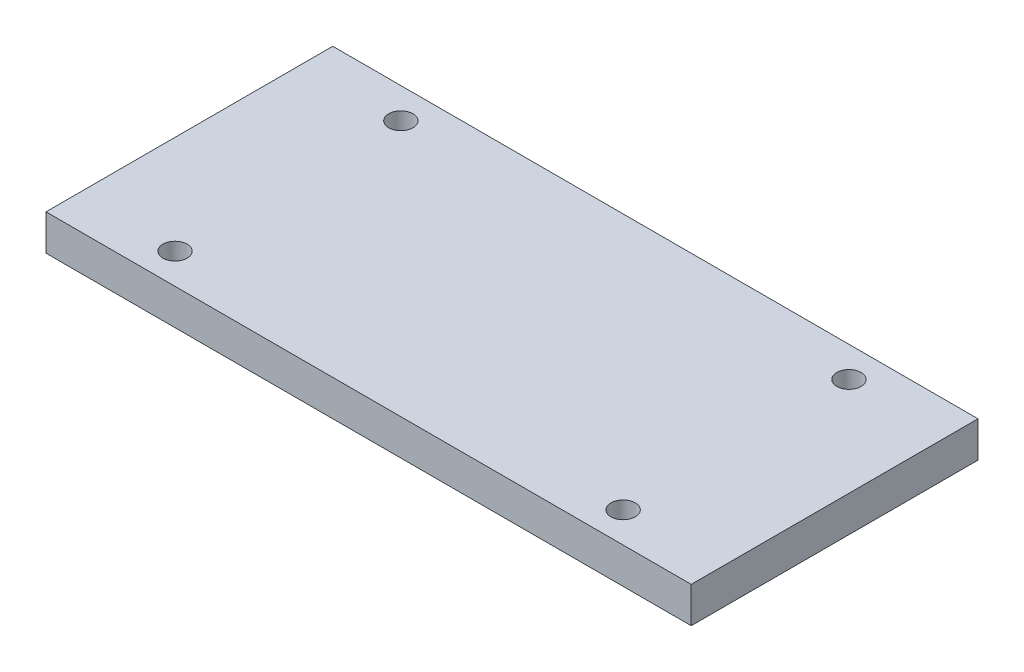
ISO-10303-21;
HEADER;
FILE_DESCRIPTION(('STEP AP214'),'2;1');
FILE_NAME('part.step','',(''),(''),'','','');
FILE_SCHEMA(('AUTOMOTIVE_DESIGN { 1 0 10303 214 1 1 1 1 }'));
ENDSEC;
DATA;
#1=APPLICATION_CONTEXT('core data for automotive mechanical design processes');
#2=APPLICATION_PROTOCOL_DEFINITION('international standard','automotive_design',2000,#1);
#3=PRODUCT_CONTEXT('',#1,'mechanical');
#4=PRODUCT('Part','Part','',(#3));
#5=PRODUCT_RELATED_PRODUCT_CATEGORY('part','',(#4));
#6=PRODUCT_DEFINITION_FORMATION('','',#4);
#7=PRODUCT_DEFINITION_CONTEXT('part definition',#1,'design');
#8=PRODUCT_DEFINITION('design','',#6,#7);
#9=PRODUCT_DEFINITION_SHAPE('','',#8);
#10=(LENGTH_UNIT() NAMED_UNIT(*) SI_UNIT(.MILLI.,.METRE.));
#11=(NAMED_UNIT(*) PLANE_ANGLE_UNIT() SI_UNIT($,.RADIAN.));
#12=(NAMED_UNIT(*) SI_UNIT($,.STERADIAN.) SOLID_ANGLE_UNIT());
#13=UNCERTAINTY_MEASURE_WITH_UNIT(LENGTH_MEASURE(1.E-05),#10,'distance_accuracy_value','');
#14=(GEOMETRIC_REPRESENTATION_CONTEXT(3) GLOBAL_UNCERTAINTY_ASSIGNED_CONTEXT((#13)) GLOBAL_UNIT_ASSIGNED_CONTEXT((#10,
#11,#12)) REPRESENTATION_CONTEXT('',''));
#15=CARTESIAN_POINT('',(0.,0.,0.));
#16=DIRECTION('',(0.,0.,1.));
#17=DIRECTION('',(1.,0.,0.));
#18=AXIS2_PLACEMENT_3D('',#15,#16,#17);
#19=CARTESIAN_POINT('',(57.15,3.175,25.4));
#20=DIRECTION('',(-1.,0.,0.));
#21=DIRECTION('',(0.,0.,1.));
#22=AXIS2_PLACEMENT_3D('',#19,#20,#21);
#23=PLANE('',#22);
#24=DIRECTION('',(0.,0.,-1.));
#25=VECTOR('',#24,1.);
#26=CARTESIAN_POINT('',(57.15,-3.175,25.4));
#27=LINE('',#26,#25);
#28=CARTESIAN_POINT('',(57.15,-3.175,25.4));
#29=VERTEX_POINT('',#28);
#30=CARTESIAN_POINT('',(57.15,-3.175,-25.4));
#31=VERTEX_POINT('',#30);
#32=EDGE_CURVE('E99',#29,#31,#27,.T.);
#33=ORIENTED_EDGE('',*,*,#32,.T.);
#34=DIRECTION('',(0.,-1.,0.));
#35=VECTOR('',#34,1.);
#36=CARTESIAN_POINT('',(57.15,3.175,-25.4));
#37=LINE('',#36,#35);
#38=CARTESIAN_POINT('',(57.15,3.175,-25.4));
#39=VERTEX_POINT('',#38);
#40=EDGE_CURVE('E11',#39,#31,#37,.T.);
#41=ORIENTED_EDGE('',*,*,#40,.F.);
#42=DIRECTION('',(0.,0.,-1.));
#43=VECTOR('',#42,1.);
#44=CARTESIAN_POINT('',(57.15,3.175,25.4));
#45=LINE('',#44,#43);
#46=CARTESIAN_POINT('',(57.15,3.175,25.4));
#47=VERTEX_POINT('',#46);
#48=EDGE_CURVE('E87',#47,#39,#45,.T.);
#49=ORIENTED_EDGE('',*,*,#48,.F.);
#50=DIRECTION('',(0.,-1.,0.));
#51=VECTOR('',#50,1.);
#52=CARTESIAN_POINT('',(57.15,3.175,25.4));
#53=LINE('',#52,#51);
#54=EDGE_CURVE('E95',#47,#29,#53,.T.);
#55=ORIENTED_EDGE('',*,*,#54,.T.);
#56=EDGE_LOOP('',(#33,#41,#49,#55));
#57=FACE_BOUND('',#56,.T.);
#58=ADVANCED_FACE('F36',(#57),#23,.F.);
#59=CARTESIAN_POINT('',(-57.15,3.175,-25.4));
#60=DIRECTION('',(0.,0.,1.));
#61=DIRECTION('',(1.,0.,0.));
#62=AXIS2_PLACEMENT_3D('',#59,#60,#61);
#63=PLANE('',#62);
#64=DIRECTION('',(-1.,0.,0.));
#65=VECTOR('',#64,1.);
#66=CARTESIAN_POINT('',(-57.15,-3.175,-25.4));
#67=LINE('',#66,#65);
#68=CARTESIAN_POINT('',(-57.15,-3.175,-25.4));
#69=VERTEX_POINT('',#68);
#70=EDGE_CURVE('E91',#31,#69,#67,.T.);
#71=ORIENTED_EDGE('',*,*,#70,.T.);
#72=DIRECTION('',(0.,-1.,0.));
#73=VECTOR('',#72,1.);
#74=CARTESIAN_POINT('',(-57.15,3.175,-25.4));
#75=LINE('',#74,#73);
#76=CARTESIAN_POINT('',(-57.15,3.175,-25.4));
#77=VERTEX_POINT('',#76);
#78=EDGE_CURVE('E44',#77,#69,#75,.T.);
#79=ORIENTED_EDGE('',*,*,#78,.F.);
#80=DIRECTION('',(-1.,0.,0.));
#81=VECTOR('',#80,1.);
#82=CARTESIAN_POINT('',(-57.15,3.175,-25.4));
#83=LINE('',#82,#81);
#84=EDGE_CURVE('E82',#39,#77,#83,.T.);
#85=ORIENTED_EDGE('',*,*,#84,.F.);
#86=ORIENTED_EDGE('',*,*,#40,.T.);
#87=EDGE_LOOP('',(#71,#79,#85,#86));
#88=FACE_BOUND('',#87,.T.);
#89=ADVANCED_FACE('F90',(#88),#63,.F.);
#90=CARTESIAN_POINT('',(-57.15,3.175,25.4));
#91=DIRECTION('',(1.,0.,0.));
#92=DIRECTION('',(0.,0.,-1.));
#93=AXIS2_PLACEMENT_3D('',#90,#91,#92);
#94=PLANE('',#93);
#95=DIRECTION('',(0.,0.,1.));
#96=VECTOR('',#95,1.);
#97=CARTESIAN_POINT('',(-57.15,-3.175,25.4));
#98=LINE('',#97,#96);
#99=CARTESIAN_POINT('',(-57.15,-3.175,25.4));
#100=VERTEX_POINT('',#99);
#101=EDGE_CURVE('E69',#69,#100,#98,.T.);
#102=ORIENTED_EDGE('',*,*,#101,.T.);
#103=DIRECTION('',(0.,-1.,0.));
#104=VECTOR('',#103,1.);
#105=CARTESIAN_POINT('',(-57.15,3.175,25.4));
#106=LINE('',#105,#104);
#107=CARTESIAN_POINT('',(-57.15,3.175,25.4));
#108=VERTEX_POINT('',#107);
#109=EDGE_CURVE('E92',#108,#100,#106,.T.);
#110=ORIENTED_EDGE('',*,*,#109,.F.);
#111=DIRECTION('',(0.,0.,1.));
#112=VECTOR('',#111,1.);
#113=CARTESIAN_POINT('',(-57.15,3.175,25.4));
#114=LINE('',#113,#112);
#115=EDGE_CURVE('E85',#77,#108,#114,.T.);
#116=ORIENTED_EDGE('',*,*,#115,.F.);
#117=ORIENTED_EDGE('',*,*,#78,.T.);
#118=EDGE_LOOP('',(#102,#110,#116,#117));
#119=FACE_BOUND('',#118,.T.);
#120=ADVANCED_FACE('F93',(#119),#94,.F.);
#121=CARTESIAN_POINT('',(-57.15,3.175,25.4));
#122=DIRECTION('',(0.,0.,-1.));
#123=DIRECTION('',(-1.,0.,0.));
#124=AXIS2_PLACEMENT_3D('',#121,#122,#123);
#125=PLANE('',#124);
#126=DIRECTION('',(1.,0.,0.));
#127=VECTOR('',#126,1.);
#128=CARTESIAN_POINT('',(-57.15,-3.175,25.4));
#129=LINE('',#128,#127);
#130=EDGE_CURVE('E75',#100,#29,#129,.T.);
#131=ORIENTED_EDGE('',*,*,#130,.T.);
#132=ORIENTED_EDGE('',*,*,#54,.F.);
#133=DIRECTION('',(1.,0.,0.));
#134=VECTOR('',#133,1.);
#135=CARTESIAN_POINT('',(-57.15,3.175,25.4));
#136=LINE('',#135,#134);
#137=EDGE_CURVE('E52',#108,#47,#136,.T.);
#138=ORIENTED_EDGE('',*,*,#137,.F.);
#139=ORIENTED_EDGE('',*,*,#109,.T.);
#140=EDGE_LOOP('',(#131,#132,#138,#139));
#141=FACE_BOUND('',#140,.T.);
#142=ADVANCED_FACE('F107',(#141),#125,.F.);
#143=CARTESIAN_POINT('',(0.,3.175,0.));
#144=DIRECTION('',(0.,-1.,0.));
#145=DIRECTION('',(0.,0.,-1.));
#146=AXIS2_PLACEMENT_3D('',#143,#144,#145);
#147=PLANE('',#146);
#148=CARTESIAN_POINT('',(39.6875,3.175,20.0025));
#149=DIRECTION('',(0.,-1.,0.));
#150=DIRECTION('',(0.,0.,-1.));
#151=AXIS2_PLACEMENT_3D('',#148,#149,#150);
#152=CIRCLE('',#151,2.15264999999999);
#153=CARTESIAN_POINT('',(39.6875,3.175,17.84985));
#154=VERTEX_POINT('',#153);
#155=EDGE_CURVE('E130',#154,#154,#152,.T.);
#156=ORIENTED_EDGE('',*,*,#155,.T.);
#157=EDGE_LOOP('',(#156));
#158=FACE_BOUND('',#157,.T.);
#159=CARTESIAN_POINT('',(39.6875,3.175,-20.0025));
#160=DIRECTION('',(0.,-1.,0.));
#161=DIRECTION('',(0.,0.,-1.));
#162=AXIS2_PLACEMENT_3D('',#159,#160,#161);
#163=CIRCLE('',#162,2.15264999999999);
#164=CARTESIAN_POINT('',(39.6875,3.175,-22.15515));
#165=VERTEX_POINT('',#164);
#166=EDGE_CURVE('E124',#165,#165,#163,.T.);
#167=ORIENTED_EDGE('',*,*,#166,.T.);
#168=EDGE_LOOP('',(#167));
#169=FACE_BOUND('',#168,.T.);
#170=CARTESIAN_POINT('',(-39.6875,3.175,-20.0025));
#171=DIRECTION('',(0.,-1.,0.));
#172=DIRECTION('',(0.,0.,-1.));
#173=AXIS2_PLACEMENT_3D('',#170,#171,#172);
#174=CIRCLE('',#173,2.15264999999999);
#175=CARTESIAN_POINT('',(-39.6875,3.175,-22.15515));
#176=VERTEX_POINT('',#175);
#177=EDGE_CURVE('E118',#176,#176,#174,.T.);
#178=ORIENTED_EDGE('',*,*,#177,.T.);
#179=EDGE_LOOP('',(#178));
#180=FACE_BOUND('',#179,.T.);
#181=CARTESIAN_POINT('',(-39.6875,3.175,20.0025));
#182=DIRECTION('',(0.,-1.,0.));
#183=DIRECTION('',(0.,0.,-1.));
#184=AXIS2_PLACEMENT_3D('',#181,#182,#183);
#185=CIRCLE('',#184,2.15264999999999);
#186=CARTESIAN_POINT('',(-39.6875,3.175,17.84985));
#187=VERTEX_POINT('',#186);
#188=EDGE_CURVE('E102',#187,#187,#185,.T.);
#189=ORIENTED_EDGE('',*,*,#188,.T.);
#190=EDGE_LOOP('',(#189));
#191=FACE_BOUND('',#190,.T.);
#192=ORIENTED_EDGE('',*,*,#48,.T.);
#193=ORIENTED_EDGE('',*,*,#84,.T.);
#194=ORIENTED_EDGE('',*,*,#115,.T.);
#195=ORIENTED_EDGE('',*,*,#137,.T.);
#196=EDGE_LOOP('',(#192,#193,#194,#195));
#197=FACE_BOUND('',#196,.T.);
#198=ADVANCED_FACE('F83',(#158,#169,#180,#191,#197),#147,.F.);
#199=CARTESIAN_POINT('',(0.,-3.175,0.));
#200=DIRECTION('',(0.,-1.,0.));
#201=DIRECTION('',(0.,0.,-1.));
#202=AXIS2_PLACEMENT_3D('',#199,#200,#201);
#203=PLANE('',#202);
#204=CARTESIAN_POINT('',(39.6875,-3.175,20.0025));
#205=DIRECTION('',(0.,-1.,0.));
#206=DIRECTION('',(0.,0.,-1.));
#207=AXIS2_PLACEMENT_3D('',#204,#205,#206);
#208=CIRCLE('',#207,2.15264999999999);
#209=CARTESIAN_POINT('',(39.6875,-3.175,17.84985));
#210=VERTEX_POINT('',#209);
#211=EDGE_CURVE('E133',#210,#210,#208,.T.);
#212=ORIENTED_EDGE('',*,*,#211,.F.);
#213=EDGE_LOOP('',(#212));
#214=FACE_BOUND('',#213,.T.);
#215=CARTESIAN_POINT('',(39.6875,-3.175,-20.0025));
#216=DIRECTION('',(0.,-1.,0.));
#217=DIRECTION('',(0.,0.,-1.));
#218=AXIS2_PLACEMENT_3D('',#215,#216,#217);
#219=CIRCLE('',#218,2.15264999999999);
#220=CARTESIAN_POINT('',(39.6875,-3.175,-22.15515));
#221=VERTEX_POINT('',#220);
#222=EDGE_CURVE('E127',#221,#221,#219,.T.);
#223=ORIENTED_EDGE('',*,*,#222,.F.);
#224=EDGE_LOOP('',(#223));
#225=FACE_BOUND('',#224,.T.);
#226=CARTESIAN_POINT('',(-39.6875,-3.175,-20.0025));
#227=DIRECTION('',(0.,-1.,0.));
#228=DIRECTION('',(0.,0.,-1.));
#229=AXIS2_PLACEMENT_3D('',#226,#227,#228);
#230=CIRCLE('',#229,2.15264999999999);
#231=CARTESIAN_POINT('',(-39.6875,-3.175,-22.15515));
#232=VERTEX_POINT('',#231);
#233=EDGE_CURVE('E121',#232,#232,#230,.T.);
#234=ORIENTED_EDGE('',*,*,#233,.F.);
#235=EDGE_LOOP('',(#234));
#236=FACE_BOUND('',#235,.T.);
#237=CARTESIAN_POINT('',(-39.6875,-3.175,20.0025));
#238=DIRECTION('',(0.,-1.,0.));
#239=DIRECTION('',(0.,0.,-1.));
#240=AXIS2_PLACEMENT_3D('',#237,#238,#239);
#241=CIRCLE('',#240,2.15264999999999);
#242=CARTESIAN_POINT('',(-39.6875,-3.175,17.84985));
#243=VERTEX_POINT('',#242);
#244=EDGE_CURVE('E115',#243,#243,#241,.T.);
#245=ORIENTED_EDGE('',*,*,#244,.F.);
#246=EDGE_LOOP('',(#245));
#247=FACE_BOUND('',#246,.T.);
#248=ORIENTED_EDGE('',*,*,#32,.F.);
#249=ORIENTED_EDGE('',*,*,#130,.F.);
#250=ORIENTED_EDGE('',*,*,#101,.F.);
#251=ORIENTED_EDGE('',*,*,#70,.F.);
#252=EDGE_LOOP('',(#248,#249,#250,#251));
#253=FACE_BOUND('',#252,.T.);
#254=ADVANCED_FACE('F110',(#214,#225,#236,#247,#253),#203,.T.);
#255=CARTESIAN_POINT('',(-39.6875,-3.175,20.0025));
#256=DIRECTION('',(0.,-1.,0.));
#257=DIRECTION('',(0.,0.,-1.));
#258=AXIS2_PLACEMENT_3D('',#255,#256,#257);
#259=CYLINDRICAL_SURFACE('',#258,2.15264999999999);
#260=ORIENTED_EDGE('',*,*,#188,.F.);
#261=EDGE_LOOP('',(#260));
#262=FACE_BOUND('',#261,.T.);
#263=ORIENTED_EDGE('',*,*,#244,.T.);
#264=EDGE_LOOP('',(#263));
#265=FACE_BOUND('',#264,.T.);
#266=ADVANCED_FACE('F141',(#262,#265),#259,.F.);
#267=CARTESIAN_POINT('',(-39.6875,-3.175,-20.0025));
#268=DIRECTION('',(0.,-1.,0.));
#269=DIRECTION('',(0.,0.,-1.));
#270=AXIS2_PLACEMENT_3D('',#267,#268,#269);
#271=CYLINDRICAL_SURFACE('',#270,2.15264999999999);
#272=ORIENTED_EDGE('',*,*,#177,.F.);
#273=EDGE_LOOP('',(#272));
#274=FACE_BOUND('',#273,.T.);
#275=ORIENTED_EDGE('',*,*,#233,.T.);
#276=EDGE_LOOP('',(#275));
#277=FACE_BOUND('',#276,.T.);
#278=ADVANCED_FACE('F150',(#274,#277),#271,.F.);
#279=CARTESIAN_POINT('',(39.6875,-3.175,-20.0025));
#280=DIRECTION('',(0.,-1.,0.));
#281=DIRECTION('',(0.,0.,-1.));
#282=AXIS2_PLACEMENT_3D('',#279,#280,#281);
#283=CYLINDRICAL_SURFACE('',#282,2.15264999999999);
#284=ORIENTED_EDGE('',*,*,#166,.F.);
#285=EDGE_LOOP('',(#284));
#286=FACE_BOUND('',#285,.T.);
#287=ORIENTED_EDGE('',*,*,#222,.T.);
#288=EDGE_LOOP('',(#287));
#289=FACE_BOUND('',#288,.T.);
#290=ADVANCED_FACE('F157',(#286,#289),#283,.F.);
#291=CARTESIAN_POINT('',(39.6875,-3.175,20.0025));
#292=DIRECTION('',(0.,-1.,0.));
#293=DIRECTION('',(0.,0.,-1.));
#294=AXIS2_PLACEMENT_3D('',#291,#292,#293);
#295=CYLINDRICAL_SURFACE('',#294,2.15264999999999);
#296=ORIENTED_EDGE('',*,*,#155,.F.);
#297=EDGE_LOOP('',(#296));
#298=FACE_BOUND('',#297,.T.);
#299=ORIENTED_EDGE('',*,*,#211,.T.);
#300=EDGE_LOOP('',(#299));
#301=FACE_BOUND('',#300,.T.);
#302=ADVANCED_FACE('F137',(#298,#301),#295,.F.);
#303=CLOSED_SHELL('',(#58,#89,#120,#142,#198,#254,#266,#278,#290,#302));
#304=MANIFOLD_SOLID_BREP('B2',#303);
#305=ADVANCED_BREP_SHAPE_REPRESENTATION('',(#18,#304),#14);
#306=SHAPE_DEFINITION_REPRESENTATION(#9,#305);
ENDSEC;
END-ISO-10303-21;
